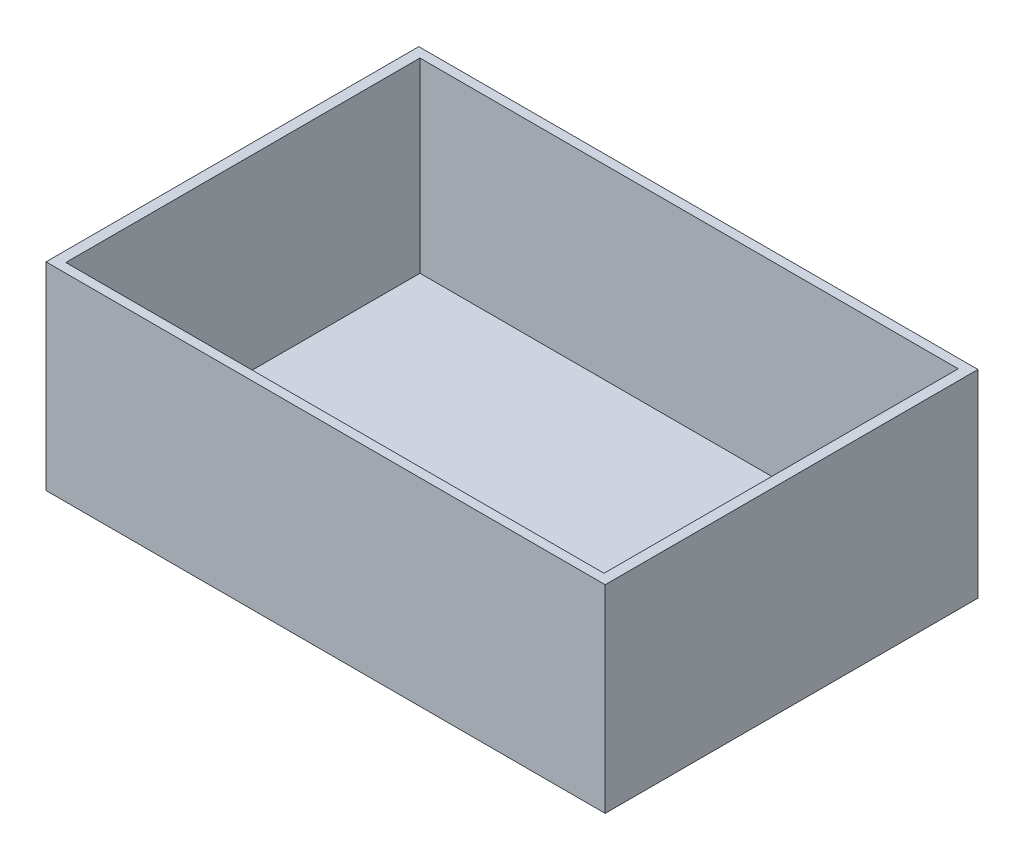
ISO-10303-21;
HEADER;
FILE_DESCRIPTION(('STEP AP214'),'2;1');
FILE_NAME('part.step','',(''),(''),'','','');
FILE_SCHEMA(('AUTOMOTIVE_DESIGN { 1 0 10303 214 1 1 1 1 }'));
ENDSEC;
DATA;
#1=APPLICATION_CONTEXT('core data for automotive mechanical design processes');
#2=APPLICATION_PROTOCOL_DEFINITION('international standard','automotive_design',2000,#1);
#3=PRODUCT_CONTEXT('',#1,'mechanical');
#4=PRODUCT('Part','Part','',(#3));
#5=PRODUCT_RELATED_PRODUCT_CATEGORY('part','',(#4));
#6=PRODUCT_DEFINITION_FORMATION('','',#4);
#7=PRODUCT_DEFINITION_CONTEXT('part definition',#1,'design');
#8=PRODUCT_DEFINITION('design','',#6,#7);
#9=PRODUCT_DEFINITION_SHAPE('','',#8);
#10=(LENGTH_UNIT() NAMED_UNIT(*) SI_UNIT(.MILLI.,.METRE.));
#11=(NAMED_UNIT(*) PLANE_ANGLE_UNIT() SI_UNIT($,.RADIAN.));
#12=(NAMED_UNIT(*) SI_UNIT($,.STERADIAN.) SOLID_ANGLE_UNIT());
#13=UNCERTAINTY_MEASURE_WITH_UNIT(LENGTH_MEASURE(1.E-05),#10,'distance_accuracy_value','');
#14=(GEOMETRIC_REPRESENTATION_CONTEXT(3) GLOBAL_UNCERTAINTY_ASSIGNED_CONTEXT((#13)) GLOBAL_UNIT_ASSIGNED_CONTEXT((#10,
#11,#12)) REPRESENTATION_CONTEXT('',''));
#15=CARTESIAN_POINT('',(0.,0.,0.));
#16=DIRECTION('',(0.,0.,1.));
#17=DIRECTION('',(1.,0.,0.));
#18=AXIS2_PLACEMENT_3D('',#15,#16,#17);
#19=CARTESIAN_POINT('',(-24.,17.,16.));
#20=DIRECTION('',(1.,0.,0.));
#21=DIRECTION('',(0.,0.,-1.));
#22=AXIS2_PLACEMENT_3D('',#19,#20,#21);
#23=PLANE('',#22);
#24=DIRECTION('',(0.,0.,1.));
#25=VECTOR('',#24,1.);
#26=CARTESIAN_POINT('',(-24.,0.,16.));
#27=LINE('',#26,#25);
#28=CARTESIAN_POINT('',(-24.,0.,-16.));
#29=VERTEX_POINT('',#28);
#30=CARTESIAN_POINT('',(-24.,0.,16.));
#31=VERTEX_POINT('',#30);
#32=EDGE_CURVE('E141',#29,#31,#27,.T.);
#33=ORIENTED_EDGE('',*,*,#32,.T.);
#34=DIRECTION('',(0.,-1.,0.));
#35=VECTOR('',#34,1.);
#36=CARTESIAN_POINT('',(-24.,17.,16.));
#37=LINE('',#36,#35);
#38=CARTESIAN_POINT('',(-24.,17.,16.));
#39=VERTEX_POINT('',#38);
#40=EDGE_CURVE('E11',#39,#31,#37,.T.);
#41=ORIENTED_EDGE('',*,*,#40,.F.);
#42=DIRECTION('',(0.,0.,1.));
#43=VECTOR('',#42,1.);
#44=CARTESIAN_POINT('',(-24.,17.,16.));
#45=LINE('',#44,#43);
#46=CARTESIAN_POINT('',(-24.,17.,-16.));
#47=VERTEX_POINT('',#46);
#48=EDGE_CURVE('E145',#47,#39,#45,.T.);
#49=ORIENTED_EDGE('',*,*,#48,.F.);
#50=DIRECTION('',(0.,-1.,0.));
#51=VECTOR('',#50,1.);
#52=CARTESIAN_POINT('',(-24.,17.,-16.));
#53=LINE('',#52,#51);
#54=EDGE_CURVE('E151',#47,#29,#53,.T.);
#55=ORIENTED_EDGE('',*,*,#54,.T.);
#56=EDGE_LOOP('',(#33,#41,#49,#55));
#57=FACE_BOUND('',#56,.T.);
#58=ADVANCED_FACE('F34',(#57),#23,.F.);
#59=CARTESIAN_POINT('',(24.,17.,16.));
#60=DIRECTION('',(0.,0.,-1.));
#61=DIRECTION('',(-1.,0.,0.));
#62=AXIS2_PLACEMENT_3D('',#59,#60,#61);
#63=PLANE('',#62);
#64=DIRECTION('',(1.,0.,0.));
#65=VECTOR('',#64,1.);
#66=CARTESIAN_POINT('',(24.,0.,16.));
#67=LINE('',#66,#65);
#68=CARTESIAN_POINT('',(24.,0.,16.));
#69=VERTEX_POINT('',#68);
#70=EDGE_CURVE('E154',#31,#69,#67,.T.);
#71=ORIENTED_EDGE('',*,*,#70,.T.);
#72=DIRECTION('',(0.,-1.,0.));
#73=VECTOR('',#72,1.);
#74=CARTESIAN_POINT('',(24.,17.,16.));
#75=LINE('',#74,#73);
#76=CARTESIAN_POINT('',(24.,17.,16.));
#77=VERTEX_POINT('',#76);
#78=EDGE_CURVE('E41',#77,#69,#75,.T.);
#79=ORIENTED_EDGE('',*,*,#78,.F.);
#80=DIRECTION('',(1.,0.,0.));
#81=VECTOR('',#80,1.);
#82=CARTESIAN_POINT('',(24.,17.,16.));
#83=LINE('',#82,#81);
#84=EDGE_CURVE('E85',#39,#77,#83,.T.);
#85=ORIENTED_EDGE('',*,*,#84,.F.);
#86=ORIENTED_EDGE('',*,*,#40,.T.);
#87=EDGE_LOOP('',(#71,#79,#85,#86));
#88=FACE_BOUND('',#87,.T.);
#89=ADVANCED_FACE('F183',(#88),#63,.F.);
#90=CARTESIAN_POINT('',(24.,17.,16.));
#91=DIRECTION('',(-1.,0.,0.));
#92=DIRECTION('',(0.,0.,1.));
#93=AXIS2_PLACEMENT_3D('',#90,#91,#92);
#94=PLANE('',#93);
#95=DIRECTION('',(0.,0.,-1.));
#96=VECTOR('',#95,1.);
#97=CARTESIAN_POINT('',(24.,0.,16.));
#98=LINE('',#97,#96);
#99=CARTESIAN_POINT('',(24.,0.,-16.));
#100=VERTEX_POINT('',#99);
#101=EDGE_CURVE('E156',#69,#100,#98,.T.);
#102=ORIENTED_EDGE('',*,*,#101,.T.);
#103=DIRECTION('',(0.,-1.,0.));
#104=VECTOR('',#103,1.);
#105=CARTESIAN_POINT('',(24.,17.,-16.));
#106=LINE('',#105,#104);
#107=CARTESIAN_POINT('',(24.,17.,-16.));
#108=VERTEX_POINT('',#107);
#109=EDGE_CURVE('E160',#108,#100,#106,.T.);
#110=ORIENTED_EDGE('',*,*,#109,.F.);
#111=DIRECTION('',(0.,0.,-1.));
#112=VECTOR('',#111,1.);
#113=CARTESIAN_POINT('',(24.,17.,16.));
#114=LINE('',#113,#112);
#115=EDGE_CURVE('E148',#77,#108,#114,.T.);
#116=ORIENTED_EDGE('',*,*,#115,.F.);
#117=ORIENTED_EDGE('',*,*,#78,.T.);
#118=EDGE_LOOP('',(#102,#110,#116,#117));
#119=FACE_BOUND('',#118,.T.);
#120=ADVANCED_FACE('F165',(#119),#94,.F.);
#121=CARTESIAN_POINT('',(24.,17.,-16.));
#122=DIRECTION('',(0.,0.,1.));
#123=DIRECTION('',(1.,0.,0.));
#124=AXIS2_PLACEMENT_3D('',#121,#122,#123);
#125=PLANE('',#124);
#126=DIRECTION('',(-1.,0.,0.));
#127=VECTOR('',#126,1.);
#128=CARTESIAN_POINT('',(24.,0.,-16.));
#129=LINE('',#128,#127);
#130=EDGE_CURVE('E78',#100,#29,#129,.T.);
#131=ORIENTED_EDGE('',*,*,#130,.T.);
#132=ORIENTED_EDGE('',*,*,#54,.F.);
#133=DIRECTION('',(-1.,0.,0.));
#134=VECTOR('',#133,1.);
#135=CARTESIAN_POINT('',(24.,17.,-16.));
#136=LINE('',#135,#134);
#137=EDGE_CURVE('E57',#108,#47,#136,.T.);
#138=ORIENTED_EDGE('',*,*,#137,.F.);
#139=ORIENTED_EDGE('',*,*,#109,.T.);
#140=EDGE_LOOP('',(#131,#132,#138,#139));
#141=FACE_BOUND('',#140,.T.);
#142=ADVANCED_FACE('F173',(#141),#125,.F.);
#143=CARTESIAN_POINT('',(0.,17.,0.));
#144=DIRECTION('',(0.,1.,0.));
#145=DIRECTION('',(0.,0.,1.));
#146=AXIS2_PLACEMENT_3D('',#143,#144,#145);
#147=PLANE('',#146);
#148=DIRECTION('',(0.,0.,-1.));
#149=VECTOR('',#148,1.);
#150=CARTESIAN_POINT('',(23.1,17.,15.2));
#151=LINE('',#150,#149);
#152=CARTESIAN_POINT('',(23.1,17.,15.2));
#153=VERTEX_POINT('',#152);
#154=CARTESIAN_POINT('',(23.1,17.,-15.2));
#155=VERTEX_POINT('',#154);
#156=EDGE_CURVE('E48',#153,#155,#151,.T.);
#157=ORIENTED_EDGE('',*,*,#156,.F.);
#158=DIRECTION('',(-1.,0.,0.));
#159=VECTOR('',#158,1.);
#160=CARTESIAN_POINT('',(23.1,17.,15.2));
#161=LINE('',#160,#159);
#162=CARTESIAN_POINT('',(-23.1,17.,15.2));
#163=VERTEX_POINT('',#162);
#164=EDGE_CURVE('E126',#153,#163,#161,.T.);
#165=ORIENTED_EDGE('',*,*,#164,.T.);
#166=DIRECTION('',(0.,0.,-1.));
#167=VECTOR('',#166,1.);
#168=CARTESIAN_POINT('',(-23.1,17.,15.2));
#169=LINE('',#168,#167);
#170=CARTESIAN_POINT('',(-23.1,17.,-15.2));
#171=VERTEX_POINT('',#170);
#172=EDGE_CURVE('E129',#163,#171,#169,.T.);
#173=ORIENTED_EDGE('',*,*,#172,.T.);
#174=DIRECTION('',(-1.,0.,0.));
#175=VECTOR('',#174,1.);
#176=CARTESIAN_POINT('',(23.1,17.,-15.2));
#177=LINE('',#176,#175);
#178=EDGE_CURVE('E135',#155,#171,#177,.T.);
#179=ORIENTED_EDGE('',*,*,#178,.F.);
#180=EDGE_LOOP('',(#157,#165,#173,#179));
#181=FACE_BOUND('',#180,.T.);
#182=ORIENTED_EDGE('',*,*,#48,.T.);
#183=ORIENTED_EDGE('',*,*,#84,.T.);
#184=ORIENTED_EDGE('',*,*,#115,.T.);
#185=ORIENTED_EDGE('',*,*,#137,.T.);
#186=EDGE_LOOP('',(#182,#183,#184,#185));
#187=FACE_BOUND('',#186,.T.);
#188=ADVANCED_FACE('F175',(#181,#187),#147,.T.);
#189=CARTESIAN_POINT('',(0.,0.,0.));
#190=DIRECTION('',(0.,1.,0.));
#191=DIRECTION('',(0.,0.,1.));
#192=AXIS2_PLACEMENT_3D('',#189,#190,#191);
#193=PLANE('',#192);
#194=ORIENTED_EDGE('',*,*,#32,.F.);
#195=ORIENTED_EDGE('',*,*,#130,.F.);
#196=ORIENTED_EDGE('',*,*,#101,.F.);
#197=ORIENTED_EDGE('',*,*,#70,.F.);
#198=EDGE_LOOP('',(#194,#195,#196,#197));
#199=FACE_BOUND('',#198,.T.);
#200=ADVANCED_FACE('F169',(#199),#193,.F.);
#201=CARTESIAN_POINT('',(23.1,1.,15.2));
#202=DIRECTION('',(1.,0.,0.));
#203=DIRECTION('',(0.,0.,-1.));
#204=AXIS2_PLACEMENT_3D('',#201,#202,#203);
#205=PLANE('',#204);
#206=ORIENTED_EDGE('',*,*,#156,.T.);
#207=DIRECTION('',(0.,1.,0.));
#208=VECTOR('',#207,1.);
#209=CARTESIAN_POINT('',(23.1,1.,-15.2));
#210=LINE('',#209,#208);
#211=CARTESIAN_POINT('',(23.1,1.,-15.2));
#212=VERTEX_POINT('',#211);
#213=EDGE_CURVE('E105',#212,#155,#210,.T.);
#214=ORIENTED_EDGE('',*,*,#213,.F.);
#215=DIRECTION('',(0.,0.,-1.));
#216=VECTOR('',#215,1.);
#217=CARTESIAN_POINT('',(23.1,1.,15.2));
#218=LINE('',#217,#216);
#219=CARTESIAN_POINT('',(23.1,1.,15.2));
#220=VERTEX_POINT('',#219);
#221=EDGE_CURVE('E109',#220,#212,#218,.T.);
#222=ORIENTED_EDGE('',*,*,#221,.F.);
#223=DIRECTION('',(0.,1.,0.));
#224=VECTOR('',#223,1.);
#225=CARTESIAN_POINT('',(23.1,1.,15.2));
#226=LINE('',#225,#224);
#227=EDGE_CURVE('E139',#220,#153,#226,.T.);
#228=ORIENTED_EDGE('',*,*,#227,.T.);
#229=EDGE_LOOP('',(#206,#214,#222,#228));
#230=FACE_BOUND('',#229,.T.);
#231=ADVANCED_FACE('F107',(#230),#205,.F.);
#232=CARTESIAN_POINT('',(23.1,1.,15.2));
#233=DIRECTION('',(0.,0.,-1.));
#234=DIRECTION('',(-1.,0.,0.));
#235=AXIS2_PLACEMENT_3D('',#232,#233,#234);
#236=PLANE('',#235);
#237=ORIENTED_EDGE('',*,*,#164,.F.);
#238=ORIENTED_EDGE('',*,*,#227,.F.);
#239=DIRECTION('',(-1.,0.,0.));
#240=VECTOR('',#239,1.);
#241=CARTESIAN_POINT('',(23.1,1.,15.2));
#242=LINE('',#241,#240);
#243=CARTESIAN_POINT('',(-23.1,1.,15.2));
#244=VERTEX_POINT('',#243);
#245=EDGE_CURVE('E114',#220,#244,#242,.T.);
#246=ORIENTED_EDGE('',*,*,#245,.T.);
#247=DIRECTION('',(0.,1.,0.));
#248=VECTOR('',#247,1.);
#249=CARTESIAN_POINT('',(-23.1,1.,15.2));
#250=LINE('',#249,#248);
#251=EDGE_CURVE('E142',#244,#163,#250,.T.);
#252=ORIENTED_EDGE('',*,*,#251,.T.);
#253=EDGE_LOOP('',(#237,#238,#246,#252));
#254=FACE_BOUND('',#253,.T.);
#255=ADVANCED_FACE('F222',(#254),#236,.T.);
#256=CARTESIAN_POINT('',(-23.1,1.,15.2));
#257=DIRECTION('',(1.,0.,0.));
#258=DIRECTION('',(0.,0.,-1.));
#259=AXIS2_PLACEMENT_3D('',#256,#257,#258);
#260=PLANE('',#259);
#261=ORIENTED_EDGE('',*,*,#172,.F.);
#262=ORIENTED_EDGE('',*,*,#251,.F.);
#263=DIRECTION('',(0.,0.,-1.));
#264=VECTOR('',#263,1.);
#265=CARTESIAN_POINT('',(-23.1,1.,15.2));
#266=LINE('',#265,#264);
#267=CARTESIAN_POINT('',(-23.1,1.,-15.2));
#268=VERTEX_POINT('',#267);
#269=EDGE_CURVE('E122',#244,#268,#266,.T.);
#270=ORIENTED_EDGE('',*,*,#269,.T.);
#271=DIRECTION('',(0.,1.,0.));
#272=VECTOR('',#271,1.);
#273=CARTESIAN_POINT('',(-23.1,1.,-15.2));
#274=LINE('',#273,#272);
#275=EDGE_CURVE('E113',#268,#171,#274,.T.);
#276=ORIENTED_EDGE('',*,*,#275,.T.);
#277=EDGE_LOOP('',(#261,#262,#270,#276));
#278=FACE_BOUND('',#277,.T.);
#279=ADVANCED_FACE('F231',(#278),#260,.T.);
#280=CARTESIAN_POINT('',(23.1,1.,-15.2));
#281=DIRECTION('',(0.,0.,-1.));
#282=DIRECTION('',(-1.,0.,0.));
#283=AXIS2_PLACEMENT_3D('',#280,#281,#282);
#284=PLANE('',#283);
#285=ORIENTED_EDGE('',*,*,#178,.T.);
#286=ORIENTED_EDGE('',*,*,#275,.F.);
#287=DIRECTION('',(-1.,0.,0.));
#288=VECTOR('',#287,1.);
#289=CARTESIAN_POINT('',(23.1,1.,-15.2));
#290=LINE('',#289,#288);
#291=EDGE_CURVE('E118',#212,#268,#290,.T.);
#292=ORIENTED_EDGE('',*,*,#291,.F.);
#293=ORIENTED_EDGE('',*,*,#213,.T.);
#294=EDGE_LOOP('',(#285,#286,#292,#293));
#295=FACE_BOUND('',#294,.T.);
#296=ADVANCED_FACE('F119',(#295),#284,.F.);
#297=CARTESIAN_POINT('',(0.,1.,0.));
#298=DIRECTION('',(0.,1.,0.));
#299=DIRECTION('',(0.,0.,1.));
#300=AXIS2_PLACEMENT_3D('',#297,#298,#299);
#301=PLANE('',#300);
#302=ORIENTED_EDGE('',*,*,#221,.T.);
#303=ORIENTED_EDGE('',*,*,#291,.T.);
#304=ORIENTED_EDGE('',*,*,#269,.F.);
#305=ORIENTED_EDGE('',*,*,#245,.F.);
#306=EDGE_LOOP('',(#302,#303,#304,#305));
#307=FACE_BOUND('',#306,.T.);
#308=ADVANCED_FACE('F125',(#307),#301,.T.);
#309=CLOSED_SHELL('',(#58,#89,#120,#142,#188,#200,#231,#255,#279,#296,#308));
#310=MANIFOLD_SOLID_BREP('B2',#309);
#311=ADVANCED_BREP_SHAPE_REPRESENTATION('',(#18,#310),#14);
#312=SHAPE_DEFINITION_REPRESENTATION(#9,#311);
ENDSEC;
END-ISO-10303-21;
